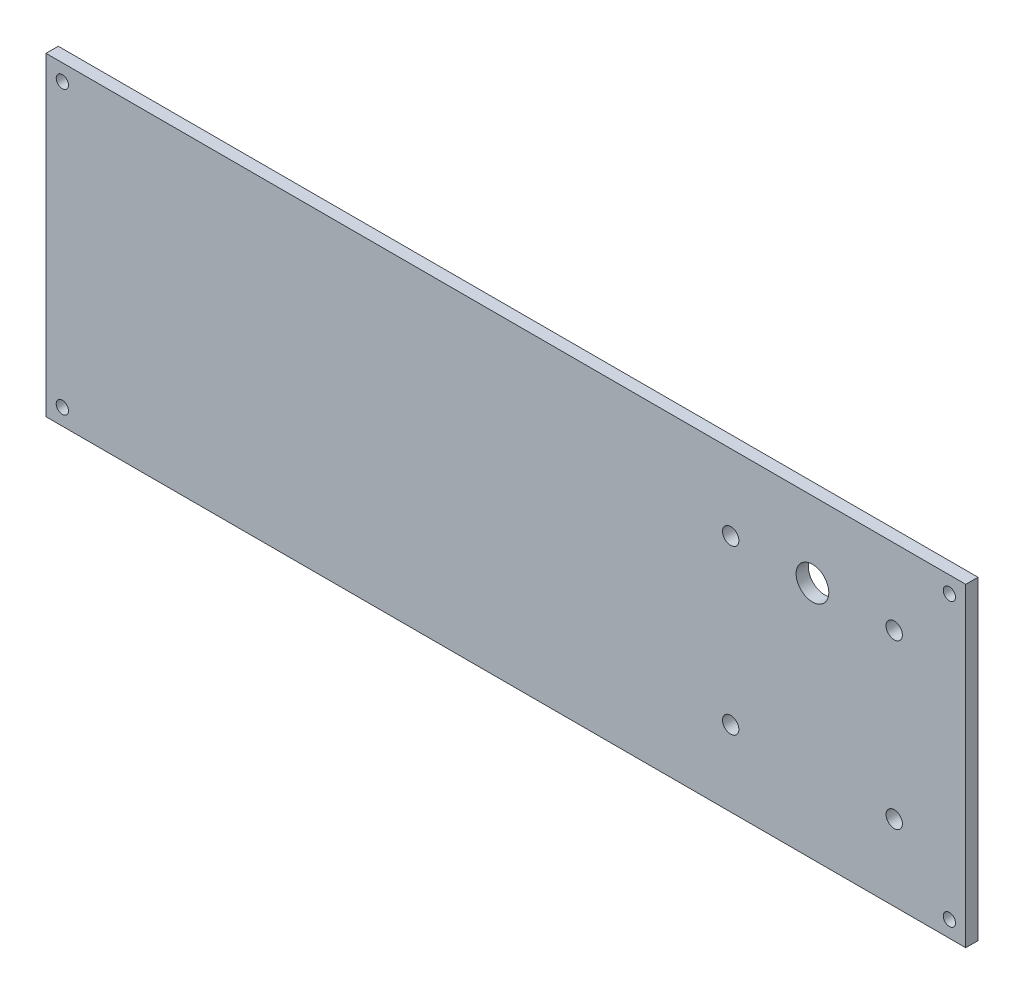
ISO-10303-21;
HEADER;
FILE_DESCRIPTION(('STEP AP214'),'2;1');
FILE_NAME('part.step','',(''),(''),'','','');
FILE_SCHEMA(('AUTOMOTIVE_DESIGN { 1 0 10303 214 1 1 1 1 }'));
ENDSEC;
DATA;
#1=APPLICATION_CONTEXT('core data for automotive mechanical design processes');
#2=APPLICATION_PROTOCOL_DEFINITION('international standard','automotive_design',2000,#1);
#3=PRODUCT_CONTEXT('',#1,'mechanical');
#4=PRODUCT('Part','Part','',(#3));
#5=PRODUCT_RELATED_PRODUCT_CATEGORY('part','',(#4));
#6=PRODUCT_DEFINITION_FORMATION('','',#4);
#7=PRODUCT_DEFINITION_CONTEXT('part definition',#1,'design');
#8=PRODUCT_DEFINITION('design','',#6,#7);
#9=PRODUCT_DEFINITION_SHAPE('','',#8);
#10=(LENGTH_UNIT() NAMED_UNIT(*) SI_UNIT(.MILLI.,.METRE.));
#11=(NAMED_UNIT(*) PLANE_ANGLE_UNIT() SI_UNIT($,.RADIAN.));
#12=(NAMED_UNIT(*) SI_UNIT($,.STERADIAN.) SOLID_ANGLE_UNIT());
#13=UNCERTAINTY_MEASURE_WITH_UNIT(LENGTH_MEASURE(1.E-05),#10,'distance_accuracy_value','');
#14=(GEOMETRIC_REPRESENTATION_CONTEXT(3) GLOBAL_UNCERTAINTY_ASSIGNED_CONTEXT((#13)) GLOBAL_UNIT_ASSIGNED_CONTEXT((#10,
#11,#12)) REPRESENTATION_CONTEXT('',''));
#15=CARTESIAN_POINT('',(0.,0.,0.));
#16=DIRECTION('',(0.,0.,1.));
#17=DIRECTION('',(1.,0.,0.));
#18=AXIS2_PLACEMENT_3D('',#15,#16,#17);
#19=CARTESIAN_POINT('',(0.,0.,3.));
#20=DIRECTION('',(0.,0.,-1.));
#21=DIRECTION('',(-1.,0.,0.));
#22=AXIS2_PLACEMENT_3D('',#19,#20,#21);
#23=PLANE('',#22);
#24=DIRECTION('',(-1.,0.,0.));
#25=VECTOR('',#24,1.);
#26=CARTESIAN_POINT('',(-213.153153153153,25.6171171171171,3.));
#27=LINE('',#26,#25);
#28=CARTESIAN_POINT('',(11.8468468468468,25.6171171171171,3.));
#29=VERTEX_POINT('',#28);
#30=CARTESIAN_POINT('',(-213.153153153153,25.6171171171171,3.));
#31=VERTEX_POINT('',#30);
#32=EDGE_CURVE('E92',#29,#31,#27,.T.);
#33=ORIENTED_EDGE('',*,*,#32,.T.);
#34=DIRECTION('',(0.,-1.,0.));
#35=VECTOR('',#34,1.);
#36=CARTESIAN_POINT('',(-213.153153153153,-51.3828828828829,3.));
#37=LINE('',#36,#35);
#38=CARTESIAN_POINT('',(-213.153153153153,-51.3828828828829,3.));
#39=VERTEX_POINT('',#38);
#40=EDGE_CURVE('E87',#31,#39,#37,.T.);
#41=ORIENTED_EDGE('',*,*,#40,.T.);
#42=DIRECTION('',(1.,0.,0.));
#43=VECTOR('',#42,1.);
#44=CARTESIAN_POINT('',(-213.153153153153,-51.3828828828829,3.));
#45=LINE('',#44,#43);
#46=CARTESIAN_POINT('',(11.8468468468468,-51.3828828828829,3.));
#47=VERTEX_POINT('',#46);
#48=EDGE_CURVE('E90',#39,#47,#45,.T.);
#49=ORIENTED_EDGE('',*,*,#48,.T.);
#50=DIRECTION('',(0.,1.,0.));
#51=VECTOR('',#50,1.);
#52=CARTESIAN_POINT('',(11.8468468468468,25.6171171171171,3.));
#53=LINE('',#52,#51);
#54=EDGE_CURVE('E57',#47,#29,#53,.T.);
#55=ORIENTED_EDGE('',*,*,#54,.T.);
#56=EDGE_LOOP('',(#33,#41,#49,#55));
#57=FACE_BOUND('',#56,.T.);
#58=CARTESIAN_POINT('',(-209.153153153153,21.6171171171171,3.));
#59=DIRECTION('',(0.,0.,1.));
#60=DIRECTION('',(1.,0.,0.));
#61=AXIS2_PLACEMENT_3D('',#58,#59,#60);
#62=CIRCLE('',#61,1.50000000000002);
#63=CARTESIAN_POINT('',(-207.653153153153,21.6171171171171,3.));
#64=VERTEX_POINT('',#63);
#65=EDGE_CURVE('E112',#64,#64,#62,.T.);
#66=ORIENTED_EDGE('',*,*,#65,.F.);
#67=EDGE_LOOP('',(#66));
#68=FACE_BOUND('',#67,.T.);
#69=CARTESIAN_POINT('',(7.84684684684683,21.6171171171171,3.));
#70=DIRECTION('',(0.,0.,1.));
#71=DIRECTION('',(1.,0.,0.));
#72=AXIS2_PLACEMENT_3D('',#69,#70,#71);
#73=CIRCLE('',#72,1.5);
#74=CARTESIAN_POINT('',(9.34684684684683,21.6171171171171,3.));
#75=VERTEX_POINT('',#74);
#76=EDGE_CURVE('E134',#75,#75,#73,.T.);
#77=ORIENTED_EDGE('',*,*,#76,.F.);
#78=EDGE_LOOP('',(#77));
#79=FACE_BOUND('',#78,.T.);
#80=CARTESIAN_POINT('',(-209.153153153153,-47.3828828828829,3.));
#81=DIRECTION('',(0.,0.,1.));
#82=DIRECTION('',(1.,0.,0.));
#83=AXIS2_PLACEMENT_3D('',#80,#81,#82);
#84=CIRCLE('',#83,1.50000000000002);
#85=CARTESIAN_POINT('',(-207.653153153153,-47.3828828828829,3.));
#86=VERTEX_POINT('',#85);
#87=EDGE_CURVE('E142',#86,#86,#84,.T.);
#88=ORIENTED_EDGE('',*,*,#87,.F.);
#89=EDGE_LOOP('',(#88));
#90=FACE_BOUND('',#89,.T.);
#91=CARTESIAN_POINT('',(7.84684684684683,-47.3828828828829,3.));
#92=DIRECTION('',(0.,0.,1.));
#93=DIRECTION('',(1.,0.,0.));
#94=AXIS2_PLACEMENT_3D('',#91,#92,#93);
#95=CIRCLE('',#94,1.5);
#96=CARTESIAN_POINT('',(9.34684684684683,-47.3828828828829,3.));
#97=VERTEX_POINT('',#96);
#98=EDGE_CURVE('E150',#97,#97,#95,.T.);
#99=ORIENTED_EDGE('',*,*,#98,.F.);
#100=EDGE_LOOP('',(#99));
#101=FACE_BOUND('',#100,.T.);
#102=CARTESIAN_POINT('',(-5.65315315315317,-32.8828828828829,3.));
#103=DIRECTION('',(0.,0.,1.));
#104=DIRECTION('',(1.,0.,0.));
#105=AXIS2_PLACEMENT_3D('',#102,#103,#104);
#106=CIRCLE('',#105,2.);
#107=CARTESIAN_POINT('',(-3.65315315315317,-32.8828828828829,3.));
#108=VERTEX_POINT('',#107);
#109=EDGE_CURVE('E158',#108,#108,#106,.T.);
#110=ORIENTED_EDGE('',*,*,#109,.F.);
#111=EDGE_LOOP('',(#110));
#112=FACE_BOUND('',#111,.T.);
#113=CARTESIAN_POINT('',(-25.653153153153,7.11711711711709,3.));
#114=DIRECTION('',(0.,0.,1.));
#115=DIRECTION('',(1.,0.,0.));
#116=AXIS2_PLACEMENT_3D('',#113,#114,#115);
#117=CIRCLE('',#116,4.);
#118=CARTESIAN_POINT('',(-21.653153153153,7.11711711711709,3.));
#119=VERTEX_POINT('',#118);
#120=EDGE_CURVE('E166',#119,#119,#117,.T.);
#121=ORIENTED_EDGE('',*,*,#120,.F.);
#122=EDGE_LOOP('',(#121));
#123=FACE_BOUND('',#122,.T.);
#124=CARTESIAN_POINT('',(-45.6531531531533,-32.8828828828828,3.));
#125=DIRECTION('',(0.,0.,1.));
#126=DIRECTION('',(1.,0.,0.));
#127=AXIS2_PLACEMENT_3D('',#124,#125,#126);
#128=CIRCLE('',#127,2.);
#129=CARTESIAN_POINT('',(-43.6531531531533,-32.8828828828828,3.));
#130=VERTEX_POINT('',#129);
#131=EDGE_CURVE('E174',#130,#130,#128,.T.);
#132=ORIENTED_EDGE('',*,*,#131,.F.);
#133=EDGE_LOOP('',(#132));
#134=FACE_BOUND('',#133,.T.);
#135=CARTESIAN_POINT('',(-45.6531531531531,7.11711711711726,3.));
#136=DIRECTION('',(0.,0.,1.));
#137=DIRECTION('',(1.,0.,0.));
#138=AXIS2_PLACEMENT_3D('',#135,#136,#137);
#139=CIRCLE('',#138,2.00000000000001);
#140=CARTESIAN_POINT('',(-43.6531531531531,7.11711711711726,3.));
#141=VERTEX_POINT('',#140);
#142=EDGE_CURVE('E182',#141,#141,#139,.T.);
#143=ORIENTED_EDGE('',*,*,#142,.F.);
#144=EDGE_LOOP('',(#143));
#145=FACE_BOUND('',#144,.T.);
#146=CARTESIAN_POINT('',(-5.65315315315298,7.11711711711692,3.));
#147=DIRECTION('',(0.,0.,1.));
#148=DIRECTION('',(1.,0.,0.));
#149=AXIS2_PLACEMENT_3D('',#146,#147,#148);
#150=CIRCLE('',#149,2.);
#151=CARTESIAN_POINT('',(-3.65315315315298,7.11711711711692,3.));
#152=VERTEX_POINT('',#151);
#153=EDGE_CURVE('E190',#152,#152,#150,.T.);
#154=ORIENTED_EDGE('',*,*,#153,.F.);
#155=EDGE_LOOP('',(#154));
#156=FACE_BOUND('',#155,.T.);
#157=ADVANCED_FACE('F39',(#57,#68,#79,#90,#101,#112,#123,#134,#145,#156),#23,.F.);
#158=CARTESIAN_POINT('',(0.,0.,0.));
#159=DIRECTION('',(0.,0.,-1.));
#160=DIRECTION('',(-1.,0.,0.));
#161=AXIS2_PLACEMENT_3D('',#158,#159,#160);
#162=PLANE('',#161);
#163=CARTESIAN_POINT('',(-45.6531531531531,7.11711711711726,0.));
#164=DIRECTION('',(0.,0.,1.));
#165=DIRECTION('',(1.,0.,0.));
#166=AXIS2_PLACEMENT_3D('',#163,#164,#165);
#167=CIRCLE('',#166,2.00000000000001);
#168=CARTESIAN_POINT('',(-43.6531531531531,7.11711711711726,0.));
#169=VERTEX_POINT('',#168);
#170=EDGE_CURVE('E186',#169,#169,#167,.T.);
#171=ORIENTED_EDGE('',*,*,#170,.T.);
#172=EDGE_LOOP('',(#171));
#173=FACE_BOUND('',#172,.T.);
#174=CARTESIAN_POINT('',(-25.653153153153,7.11711711711709,0.));
#175=DIRECTION('',(0.,0.,1.));
#176=DIRECTION('',(1.,0.,0.));
#177=AXIS2_PLACEMENT_3D('',#174,#175,#176);
#178=CIRCLE('',#177,4.);
#179=CARTESIAN_POINT('',(-21.653153153153,7.11711711711709,0.));
#180=VERTEX_POINT('',#179);
#181=EDGE_CURVE('E170',#180,#180,#178,.T.);
#182=ORIENTED_EDGE('',*,*,#181,.T.);
#183=EDGE_LOOP('',(#182));
#184=FACE_BOUND('',#183,.T.);
#185=CARTESIAN_POINT('',(7.84684684684683,-47.3828828828829,0.));
#186=DIRECTION('',(0.,0.,1.));
#187=DIRECTION('',(1.,0.,0.));
#188=AXIS2_PLACEMENT_3D('',#185,#186,#187);
#189=CIRCLE('',#188,1.5);
#190=CARTESIAN_POINT('',(9.34684684684683,-47.3828828828829,0.));
#191=VERTEX_POINT('',#190);
#192=EDGE_CURVE('E154',#191,#191,#189,.T.);
#193=ORIENTED_EDGE('',*,*,#192,.T.);
#194=EDGE_LOOP('',(#193));
#195=FACE_BOUND('',#194,.T.);
#196=CARTESIAN_POINT('',(7.84684684684683,21.6171171171171,0.));
#197=DIRECTION('',(0.,0.,1.));
#198=DIRECTION('',(1.,0.,0.));
#199=AXIS2_PLACEMENT_3D('',#196,#197,#198);
#200=CIRCLE('',#199,1.5);
#201=CARTESIAN_POINT('',(9.34684684684683,21.6171171171171,0.));
#202=VERTEX_POINT('',#201);
#203=EDGE_CURVE('E138',#202,#202,#200,.T.);
#204=ORIENTED_EDGE('',*,*,#203,.T.);
#205=EDGE_LOOP('',(#204));
#206=FACE_BOUND('',#205,.T.);
#207=DIRECTION('',(-1.,0.,0.));
#208=VECTOR('',#207,1.);
#209=CARTESIAN_POINT('',(-213.153153153153,25.6171171171171,0.));
#210=LINE('',#209,#208);
#211=CARTESIAN_POINT('',(11.8468468468468,25.6171171171171,0.));
#212=VERTEX_POINT('',#211);
#213=CARTESIAN_POINT('',(-213.153153153153,25.6171171171171,0.));
#214=VERTEX_POINT('',#213);
#215=EDGE_CURVE('E108',#212,#214,#210,.T.);
#216=ORIENTED_EDGE('',*,*,#215,.F.);
#217=DIRECTION('',(0.,1.,0.));
#218=VECTOR('',#217,1.);
#219=CARTESIAN_POINT('',(11.8468468468468,25.6171171171171,0.));
#220=LINE('',#219,#218);
#221=CARTESIAN_POINT('',(11.8468468468468,-51.3828828828829,0.));
#222=VERTEX_POINT('',#221);
#223=EDGE_CURVE('E80',#222,#212,#220,.T.);
#224=ORIENTED_EDGE('',*,*,#223,.F.);
#225=DIRECTION('',(1.,0.,0.));
#226=VECTOR('',#225,1.);
#227=CARTESIAN_POINT('',(-213.153153153153,-51.3828828828829,0.));
#228=LINE('',#227,#226);
#229=CARTESIAN_POINT('',(-213.153153153153,-51.3828828828829,0.));
#230=VERTEX_POINT('',#229);
#231=EDGE_CURVE('E74',#230,#222,#228,.T.);
#232=ORIENTED_EDGE('',*,*,#231,.F.);
#233=DIRECTION('',(0.,-1.,0.));
#234=VECTOR('',#233,1.);
#235=CARTESIAN_POINT('',(-213.153153153153,-51.3828828828829,0.));
#236=LINE('',#235,#234);
#237=EDGE_CURVE('E97',#214,#230,#236,.T.);
#238=ORIENTED_EDGE('',*,*,#237,.F.);
#239=EDGE_LOOP('',(#216,#224,#232,#238));
#240=FACE_BOUND('',#239,.T.);
#241=CARTESIAN_POINT('',(-209.153153153153,21.6171171171171,0.));
#242=DIRECTION('',(0.,0.,1.));
#243=DIRECTION('',(1.,0.,0.));
#244=AXIS2_PLACEMENT_3D('',#241,#242,#243);
#245=CIRCLE('',#244,1.50000000000002);
#246=CARTESIAN_POINT('',(-207.653153153153,21.6171171171171,0.));
#247=VERTEX_POINT('',#246);
#248=EDGE_CURVE('E130',#247,#247,#245,.T.);
#249=ORIENTED_EDGE('',*,*,#248,.T.);
#250=EDGE_LOOP('',(#249));
#251=FACE_BOUND('',#250,.T.);
#252=CARTESIAN_POINT('',(-209.153153153153,-47.3828828828829,0.));
#253=DIRECTION('',(0.,0.,1.));
#254=DIRECTION('',(1.,0.,0.));
#255=AXIS2_PLACEMENT_3D('',#252,#253,#254);
#256=CIRCLE('',#255,1.50000000000002);
#257=CARTESIAN_POINT('',(-207.653153153153,-47.3828828828829,0.));
#258=VERTEX_POINT('',#257);
#259=EDGE_CURVE('E146',#258,#258,#256,.T.);
#260=ORIENTED_EDGE('',*,*,#259,.T.);
#261=EDGE_LOOP('',(#260));
#262=FACE_BOUND('',#261,.T.);
#263=CARTESIAN_POINT('',(-5.65315315315317,-32.8828828828829,0.));
#264=DIRECTION('',(0.,0.,1.));
#265=DIRECTION('',(1.,0.,0.));
#266=AXIS2_PLACEMENT_3D('',#263,#264,#265);
#267=CIRCLE('',#266,2.);
#268=CARTESIAN_POINT('',(-3.65315315315317,-32.8828828828829,0.));
#269=VERTEX_POINT('',#268);
#270=EDGE_CURVE('E162',#269,#269,#267,.T.);
#271=ORIENTED_EDGE('',*,*,#270,.T.);
#272=EDGE_LOOP('',(#271));
#273=FACE_BOUND('',#272,.T.);
#274=CARTESIAN_POINT('',(-45.6531531531533,-32.8828828828828,0.));
#275=DIRECTION('',(0.,0.,1.));
#276=DIRECTION('',(1.,0.,0.));
#277=AXIS2_PLACEMENT_3D('',#274,#275,#276);
#278=CIRCLE('',#277,2.);
#279=CARTESIAN_POINT('',(-43.6531531531533,-32.8828828828828,0.));
#280=VERTEX_POINT('',#279);
#281=EDGE_CURVE('E178',#280,#280,#278,.T.);
#282=ORIENTED_EDGE('',*,*,#281,.T.);
#283=EDGE_LOOP('',(#282));
#284=FACE_BOUND('',#283,.T.);
#285=CARTESIAN_POINT('',(-5.65315315315298,7.11711711711692,0.));
#286=DIRECTION('',(0.,0.,1.));
#287=DIRECTION('',(1.,0.,0.));
#288=AXIS2_PLACEMENT_3D('',#285,#286,#287);
#289=CIRCLE('',#288,2.);
#290=CARTESIAN_POINT('',(-3.65315315315298,7.11711711711692,0.));
#291=VERTEX_POINT('',#290);
#292=EDGE_CURVE('E194',#291,#291,#289,.T.);
#293=ORIENTED_EDGE('',*,*,#292,.T.);
#294=EDGE_LOOP('',(#293));
#295=FACE_BOUND('',#294,.T.);
#296=ADVANCED_FACE('F125',(#173,#184,#195,#206,#240,#251,#262,#273,#284,#295),#162,.T.);
#297=CARTESIAN_POINT('',(-213.153153153153,25.6171171171171,3.));
#298=DIRECTION('',(0.,-1.,0.));
#299=DIRECTION('',(0.,0.,-1.));
#300=AXIS2_PLACEMENT_3D('',#297,#298,#299);
#301=PLANE('',#300);
#302=ORIENTED_EDGE('',*,*,#215,.T.);
#303=DIRECTION('',(0.,0.,-1.));
#304=VECTOR('',#303,1.);
#305=CARTESIAN_POINT('',(-213.153153153153,25.6171171171171,3.));
#306=LINE('',#305,#304);
#307=EDGE_CURVE('E11',#31,#214,#306,.T.);
#308=ORIENTED_EDGE('',*,*,#307,.F.);
#309=ORIENTED_EDGE('',*,*,#32,.F.);
#310=DIRECTION('',(0.,0.,-1.));
#311=VECTOR('',#310,1.);
#312=CARTESIAN_POINT('',(11.8468468468468,25.6171171171171,3.));
#313=LINE('',#312,#311);
#314=EDGE_CURVE('E104',#29,#212,#313,.T.);
#315=ORIENTED_EDGE('',*,*,#314,.T.);
#316=EDGE_LOOP('',(#302,#308,#309,#315));
#317=FACE_BOUND('',#316,.T.);
#318=ADVANCED_FACE('F41',(#317),#301,.F.);
#319=CARTESIAN_POINT('',(-213.153153153153,-51.3828828828829,3.));
#320=DIRECTION('',(1.,0.,0.));
#321=DIRECTION('',(0.,0.,-1.));
#322=AXIS2_PLACEMENT_3D('',#319,#320,#321);
#323=PLANE('',#322);
#324=ORIENTED_EDGE('',*,*,#237,.T.);
#325=DIRECTION('',(0.,0.,-1.));
#326=VECTOR('',#325,1.);
#327=CARTESIAN_POINT('',(-213.153153153153,-51.3828828828829,3.));
#328=LINE('',#327,#326);
#329=EDGE_CURVE('E49',#39,#230,#328,.T.);
#330=ORIENTED_EDGE('',*,*,#329,.F.);
#331=ORIENTED_EDGE('',*,*,#40,.F.);
#332=ORIENTED_EDGE('',*,*,#307,.T.);
#333=EDGE_LOOP('',(#324,#330,#331,#332));
#334=FACE_BOUND('',#333,.T.);
#335=ADVANCED_FACE('F96',(#334),#323,.F.);
#336=CARTESIAN_POINT('',(-213.153153153153,-51.3828828828829,3.));
#337=DIRECTION('',(0.,1.,0.));
#338=DIRECTION('',(0.,0.,1.));
#339=AXIS2_PLACEMENT_3D('',#336,#337,#338);
#340=PLANE('',#339);
#341=ORIENTED_EDGE('',*,*,#231,.T.);
#342=DIRECTION('',(0.,0.,-1.));
#343=VECTOR('',#342,1.);
#344=CARTESIAN_POINT('',(11.8468468468468,-51.3828828828829,3.));
#345=LINE('',#344,#343);
#346=EDGE_CURVE('E99',#47,#222,#345,.T.);
#347=ORIENTED_EDGE('',*,*,#346,.F.);
#348=ORIENTED_EDGE('',*,*,#48,.F.);
#349=ORIENTED_EDGE('',*,*,#329,.T.);
#350=EDGE_LOOP('',(#341,#347,#348,#349));
#351=FACE_BOUND('',#350,.T.);
#352=ADVANCED_FACE('F100',(#351),#340,.F.);
#353=CARTESIAN_POINT('',(11.8468468468468,25.6171171171171,3.));
#354=DIRECTION('',(-1.,0.,0.));
#355=DIRECTION('',(0.,0.,1.));
#356=AXIS2_PLACEMENT_3D('',#353,#354,#355);
#357=PLANE('',#356);
#358=ORIENTED_EDGE('',*,*,#223,.T.);
#359=ORIENTED_EDGE('',*,*,#314,.F.);
#360=ORIENTED_EDGE('',*,*,#54,.F.);
#361=ORIENTED_EDGE('',*,*,#346,.T.);
#362=EDGE_LOOP('',(#358,#359,#360,#361));
#363=FACE_BOUND('',#362,.T.);
#364=ADVANCED_FACE('F122',(#363),#357,.F.);
#365=CARTESIAN_POINT('',(-209.153153153153,21.6171171171171,3.));
#366=DIRECTION('',(0.,0.,-1.));
#367=DIRECTION('',(-1.,0.,0.));
#368=AXIS2_PLACEMENT_3D('',#365,#366,#367);
#369=CYLINDRICAL_SURFACE('',#368,1.50000000000002);
#370=ORIENTED_EDGE('',*,*,#65,.T.);
#371=EDGE_LOOP('',(#370));
#372=FACE_BOUND('',#371,.T.);
#373=ORIENTED_EDGE('',*,*,#248,.F.);
#374=EDGE_LOOP('',(#373));
#375=FACE_BOUND('',#374,.T.);
#376=ADVANCED_FACE('F213',(#372,#375),#369,.F.);
#377=CARTESIAN_POINT('',(7.84684684684683,21.6171171171171,3.));
#378=DIRECTION('',(0.,0.,-1.));
#379=DIRECTION('',(-1.,0.,0.));
#380=AXIS2_PLACEMENT_3D('',#377,#378,#379);
#381=CYLINDRICAL_SURFACE('',#380,1.5);
#382=ORIENTED_EDGE('',*,*,#76,.T.);
#383=EDGE_LOOP('',(#382));
#384=FACE_BOUND('',#383,.T.);
#385=ORIENTED_EDGE('',*,*,#203,.F.);
#386=EDGE_LOOP('',(#385));
#387=FACE_BOUND('',#386,.T.);
#388=ADVANCED_FACE('F259',(#384,#387),#381,.F.);
#389=CARTESIAN_POINT('',(-209.153153153153,-47.3828828828829,3.));
#390=DIRECTION('',(0.,0.,-1.));
#391=DIRECTION('',(-1.,0.,0.));
#392=AXIS2_PLACEMENT_3D('',#389,#390,#391);
#393=CYLINDRICAL_SURFACE('',#392,1.50000000000002);
#394=ORIENTED_EDGE('',*,*,#87,.T.);
#395=EDGE_LOOP('',(#394));
#396=FACE_BOUND('',#395,.T.);
#397=ORIENTED_EDGE('',*,*,#259,.F.);
#398=EDGE_LOOP('',(#397));
#399=FACE_BOUND('',#398,.T.);
#400=ADVANCED_FACE('F267',(#396,#399),#393,.F.);
#401=CARTESIAN_POINT('',(7.84684684684683,-47.3828828828829,3.));
#402=DIRECTION('',(0.,0.,-1.));
#403=DIRECTION('',(-1.,0.,0.));
#404=AXIS2_PLACEMENT_3D('',#401,#402,#403);
#405=CYLINDRICAL_SURFACE('',#404,1.5);
#406=ORIENTED_EDGE('',*,*,#98,.T.);
#407=EDGE_LOOP('',(#406));
#408=FACE_BOUND('',#407,.T.);
#409=ORIENTED_EDGE('',*,*,#192,.F.);
#410=EDGE_LOOP('',(#409));
#411=FACE_BOUND('',#410,.T.);
#412=ADVANCED_FACE('F275',(#408,#411),#405,.F.);
#413=CARTESIAN_POINT('',(-5.65315315315317,-32.8828828828829,3.));
#414=DIRECTION('',(0.,0.,-1.));
#415=DIRECTION('',(-1.,0.,0.));
#416=AXIS2_PLACEMENT_3D('',#413,#414,#415);
#417=CYLINDRICAL_SURFACE('',#416,2.);
#418=ORIENTED_EDGE('',*,*,#109,.T.);
#419=EDGE_LOOP('',(#418));
#420=FACE_BOUND('',#419,.T.);
#421=ORIENTED_EDGE('',*,*,#270,.F.);
#422=EDGE_LOOP('',(#421));
#423=FACE_BOUND('',#422,.T.);
#424=ADVANCED_FACE('F284',(#420,#423),#417,.F.);
#425=CARTESIAN_POINT('',(-25.653153153153,7.11711711711709,3.));
#426=DIRECTION('',(0.,0.,-1.));
#427=DIRECTION('',(-1.,0.,0.));
#428=AXIS2_PLACEMENT_3D('',#425,#426,#427);
#429=CYLINDRICAL_SURFACE('',#428,4.);
#430=ORIENTED_EDGE('',*,*,#120,.T.);
#431=EDGE_LOOP('',(#430));
#432=FACE_BOUND('',#431,.T.);
#433=ORIENTED_EDGE('',*,*,#181,.F.);
#434=EDGE_LOOP('',(#433));
#435=FACE_BOUND('',#434,.T.);
#436=ADVANCED_FACE('F293',(#432,#435),#429,.F.);
#437=CARTESIAN_POINT('',(-45.6531531531533,-32.8828828828828,3.));
#438=DIRECTION('',(0.,0.,-1.));
#439=DIRECTION('',(-1.,0.,0.));
#440=AXIS2_PLACEMENT_3D('',#437,#438,#439);
#441=CYLINDRICAL_SURFACE('',#440,2.);
#442=ORIENTED_EDGE('',*,*,#131,.T.);
#443=EDGE_LOOP('',(#442));
#444=FACE_BOUND('',#443,.T.);
#445=ORIENTED_EDGE('',*,*,#281,.F.);
#446=EDGE_LOOP('',(#445));
#447=FACE_BOUND('',#446,.T.);
#448=ADVANCED_FACE('F302',(#444,#447),#441,.F.);
#449=CARTESIAN_POINT('',(-45.6531531531531,7.11711711711726,3.));
#450=DIRECTION('',(0.,0.,-1.));
#451=DIRECTION('',(-1.,0.,0.));
#452=AXIS2_PLACEMENT_3D('',#449,#450,#451);
#453=CYLINDRICAL_SURFACE('',#452,2.00000000000001);
#454=ORIENTED_EDGE('',*,*,#142,.T.);
#455=EDGE_LOOP('',(#454));
#456=FACE_BOUND('',#455,.T.);
#457=ORIENTED_EDGE('',*,*,#170,.F.);
#458=EDGE_LOOP('',(#457));
#459=FACE_BOUND('',#458,.T.);
#460=ADVANCED_FACE('F311',(#456,#459),#453,.F.);
#461=CARTESIAN_POINT('',(-5.65315315315298,7.11711711711692,3.));
#462=DIRECTION('',(0.,0.,-1.));
#463=DIRECTION('',(-1.,0.,0.));
#464=AXIS2_PLACEMENT_3D('',#461,#462,#463);
#465=CYLINDRICAL_SURFACE('',#464,2.);
#466=ORIENTED_EDGE('',*,*,#153,.T.);
#467=EDGE_LOOP('',(#466));
#468=FACE_BOUND('',#467,.T.);
#469=ORIENTED_EDGE('',*,*,#292,.F.);
#470=EDGE_LOOP('',(#469));
#471=FACE_BOUND('',#470,.T.);
#472=ADVANCED_FACE('F202',(#468,#471),#465,.F.);
#473=CLOSED_SHELL('',(#157,#296,#318,#335,#352,#364,#376,#388,#400,#412,#424,#436,#448,#460,#472));
#474=MANIFOLD_SOLID_BREP('B2',#473);
#475=ADVANCED_BREP_SHAPE_REPRESENTATION('',(#18,#474),#14);
#476=SHAPE_DEFINITION_REPRESENTATION(#9,#475);
ENDSEC;
END-ISO-10303-21;
